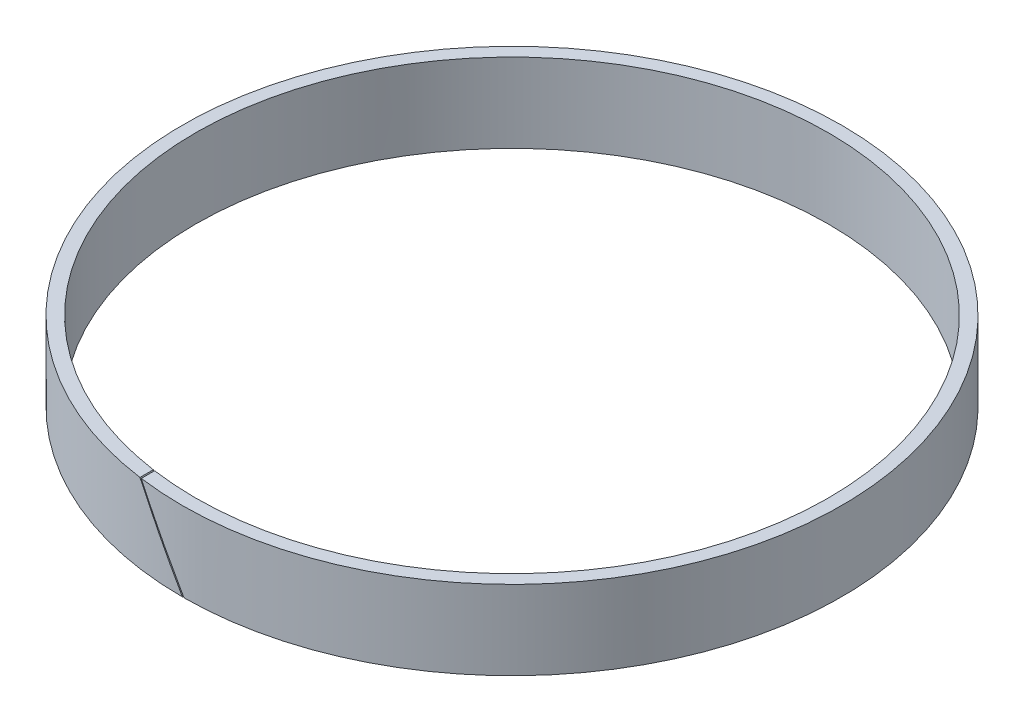
ISO-10303-21;
HEADER;
FILE_DESCRIPTION(('STEP AP214'),'2;1');
FILE_NAME('part.step','',(''),(''),'','','');
FILE_SCHEMA(('AUTOMOTIVE_DESIGN { 1 0 10303 214 1 1 1 1 }'));
ENDSEC;
DATA;
#1=APPLICATION_CONTEXT('core data for automotive mechanical design processes');
#2=APPLICATION_PROTOCOL_DEFINITION('international standard','automotive_design',2000,#1);
#3=PRODUCT_CONTEXT('',#1,'mechanical');
#4=PRODUCT('Part','Part','',(#3));
#5=PRODUCT_RELATED_PRODUCT_CATEGORY('part','',(#4));
#6=PRODUCT_DEFINITION_FORMATION('','',#4);
#7=PRODUCT_DEFINITION_CONTEXT('part definition',#1,'design');
#8=PRODUCT_DEFINITION('design','',#6,#7);
#9=PRODUCT_DEFINITION_SHAPE('','',#8);
#10=(LENGTH_UNIT() NAMED_UNIT(*) SI_UNIT(.MILLI.,.METRE.));
#11=(NAMED_UNIT(*) PLANE_ANGLE_UNIT() SI_UNIT($,.RADIAN.));
#12=(NAMED_UNIT(*) SI_UNIT($,.STERADIAN.) SOLID_ANGLE_UNIT());
#13=UNCERTAINTY_MEASURE_WITH_UNIT(LENGTH_MEASURE(1.E-05),#10,'distance_accuracy_value','');
#14=(GEOMETRIC_REPRESENTATION_CONTEXT(3) GLOBAL_UNCERTAINTY_ASSIGNED_CONTEXT((#13)) GLOBAL_UNIT_ASSIGNED_CONTEXT((#10,
#11,#12)) REPRESENTATION_CONTEXT('',''));
#15=CARTESIAN_POINT('',(0.,0.,0.));
#16=DIRECTION('',(0.,0.,1.));
#17=DIRECTION('',(1.,0.,0.));
#18=AXIS2_PLACEMENT_3D('',#15,#16,#17);
#19=CARTESIAN_POINT('',(0.,6.,0.));
#20=DIRECTION('',(0.,1.,0.));
#21=DIRECTION('',(0.,0.,1.));
#22=AXIS2_PLACEMENT_3D('',#19,#20,#21);
#23=PLANE('',#22);
#24=CARTESIAN_POINT('',(0.,6.,0.));
#25=DIRECTION('',(0.,1.,0.));
#26=DIRECTION('',(0.,0.,1.));
#27=AXIS2_PLACEMENT_3D('',#24,#25,#26);
#28=CIRCLE('',#27,24.);
#29=CARTESIAN_POINT('',(-3.34863156129984,6.,23.7652407239369));
#30=VERTEX_POINT('',#29);
#31=CARTESIAN_POINT('',(-3.46410161513777,6.,23.7486841740758));
#32=VERTEX_POINT('',#31);
#33=EDGE_CURVE('E93',#30,#32,#28,.T.);
#34=ORIENTED_EDGE('',*,*,#33,.F.);
#35=DIRECTION('',(0.,0.,-1.));
#36=VECTOR('',#35,1.);
#37=CARTESIAN_POINT('',(-3.34863156129984,6.00000000000001,25.001));
#38=LINE('',#37,#36);
#39=CARTESIAN_POINT('',(-3.34863156129984,6.,24.7747182964139));
#40=VERTEX_POINT('',#39);
#41=EDGE_CURVE('E65',#40,#30,#38,.T.);
#42=ORIENTED_EDGE('',*,*,#41,.F.);
#43=CARTESIAN_POINT('',(0.,6.,0.));
#44=DIRECTION('',(0.,1.,0.));
#45=DIRECTION('',(0.,0.,1.));
#46=AXIS2_PLACEMENT_3D('',#43,#44,#45);
#47=CIRCLE('',#46,25.);
#48=CARTESIAN_POINT('',(-3.46410161513777,6.00000000000001,24.7588368062799));
#49=VERTEX_POINT('',#48);
#50=EDGE_CURVE('E11',#40,#49,#47,.T.);
#51=ORIENTED_EDGE('',*,*,#50,.T.);
#52=DIRECTION('',(0.,0.,-1.));
#53=VECTOR('',#52,1.);
#54=CARTESIAN_POINT('',(-3.46410161513777,6.00000000000001,25.001));
#55=LINE('',#54,#53);
#56=EDGE_CURVE('E79',#49,#32,#55,.T.);
#57=ORIENTED_EDGE('',*,*,#56,.T.);
#58=EDGE_LOOP('',(#34,#42,#51,#57));
#59=FACE_BOUND('',#58,.T.);
#60=ADVANCED_FACE('F39',(#59),#23,.T.);
#61=CARTESIAN_POINT('',(0.,0.,0.));
#62=DIRECTION('',(0.,1.,0.));
#63=DIRECTION('',(0.,0.,1.));
#64=AXIS2_PLACEMENT_3D('',#61,#62,#63);
#65=PLANE('',#64);
#66=DIRECTION('',(0.,0.,-1.));
#67=VECTOR('',#66,1.);
#68=CARTESIAN_POINT('',(0.11547005383793,0.,25.001));
#69=LINE('',#68,#67);
#70=CARTESIAN_POINT('',(0.115470053837931,0.,24.9997333319111));
#71=VERTEX_POINT('',#70);
#72=CARTESIAN_POINT('',(0.11547005383793,0.,23.9997222206147));
#73=VERTEX_POINT('',#72);
#74=EDGE_CURVE('E87',#71,#73,#69,.T.);
#75=ORIENTED_EDGE('',*,*,#74,.T.);
#76=CARTESIAN_POINT('',(0.,0.,0.));
#77=DIRECTION('',(0.,1.,0.));
#78=DIRECTION('',(0.,0.,1.));
#79=AXIS2_PLACEMENT_3D('',#76,#77,#78);
#80=CIRCLE('',#79,24.);
#81=CARTESIAN_POINT('',(0.,0.,24.));
#82=VERTEX_POINT('',#81);
#83=EDGE_CURVE('E96',#73,#82,#80,.T.);
#84=ORIENTED_EDGE('',*,*,#83,.T.);
#85=DIRECTION('',(0.,0.,-1.));
#86=VECTOR('',#85,1.);
#87=CARTESIAN_POINT('',(0.,0.,25.001));
#88=LINE('',#87,#86);
#89=CARTESIAN_POINT('',(0.,0.,25.));
#90=VERTEX_POINT('',#89);
#91=EDGE_CURVE('E53',#90,#82,#88,.T.);
#92=ORIENTED_EDGE('',*,*,#91,.F.);
#93=CARTESIAN_POINT('',(0.,0.,0.));
#94=DIRECTION('',(0.,1.,0.));
#95=DIRECTION('',(0.,0.,1.));
#96=AXIS2_PLACEMENT_3D('',#93,#94,#95);
#97=CIRCLE('',#96,25.);
#98=EDGE_CURVE('E43',#71,#90,#97,.T.);
#99=ORIENTED_EDGE('',*,*,#98,.F.);
#100=EDGE_LOOP('',(#75,#84,#92,#99));
#101=FACE_BOUND('',#100,.T.);
#102=ADVANCED_FACE('F115',(#101),#65,.F.);
#103=CARTESIAN_POINT('',(0.,6.,0.));
#104=DIRECTION('',(0.,-1.,0.));
#105=DIRECTION('',(0.,0.,-1.));
#106=AXIS2_PLACEMENT_3D('',#103,#104,#105);
#107=CYLINDRICAL_SURFACE('',#106,25.);
#108=CARTESIAN_POINT('',(0.,0.200000000000006,0.));
#109=DIRECTION('',(-0.866025403784437,-0.500000000000002,0.));
#110=DIRECTION('',(0.500000000000002,-0.866025403784438,0.));
#111=AXIS2_PLACEMENT_3D('',#108,#109,#110);
#112=ELLIPSE('',#111,49.9999999999998,25.);
#113=EDGE_CURVE('E106',#40,#71,#112,.F.);
#114=ORIENTED_EDGE('',*,*,#113,.T.);
#115=ORIENTED_EDGE('',*,*,#98,.T.);
#116=CARTESIAN_POINT('',(0.,0.,0.));
#117=DIRECTION('',(0.866025403784438,0.500000000000001,0.));
#118=DIRECTION('',(0.500000000000001,-0.866025403784438,0.));
#119=AXIS2_PLACEMENT_3D('',#116,#117,#118);
#120=ELLIPSE('',#119,49.9999999999999,25.);
#121=EDGE_CURVE('E88',#90,#49,#120,.F.);
#122=ORIENTED_EDGE('',*,*,#121,.T.);
#123=ORIENTED_EDGE('',*,*,#50,.F.);
#124=EDGE_LOOP('',(#114,#115,#122,#123));
#125=FACE_BOUND('',#124,.T.);
#126=ADVANCED_FACE('F41',(#125),#107,.T.);
#127=CARTESIAN_POINT('',(0.,6.,0.));
#128=DIRECTION('',(0.,-1.,0.));
#129=DIRECTION('',(0.,0.,-1.));
#130=AXIS2_PLACEMENT_3D('',#127,#128,#129);
#131=CYLINDRICAL_SURFACE('',#130,24.);
#132=ORIENTED_EDGE('',*,*,#83,.F.);
#133=CARTESIAN_POINT('',(0.,0.200000000000006,0.));
#134=DIRECTION('',(-0.866025403784437,-0.500000000000002,0.));
#135=DIRECTION('',(0.500000000000002,-0.866025403784438,0.));
#136=AXIS2_PLACEMENT_3D('',#133,#134,#135);
#137=ELLIPSE('',#136,47.9999999999998,24.);
#138=EDGE_CURVE('E92',#30,#73,#137,.F.);
#139=ORIENTED_EDGE('',*,*,#138,.F.);
#140=ORIENTED_EDGE('',*,*,#33,.T.);
#141=CARTESIAN_POINT('',(0.,0.,0.));
#142=DIRECTION('',(0.866025403784438,0.500000000000001,0.));
#143=DIRECTION('',(0.500000000000001,-0.866025403784438,0.));
#144=AXIS2_PLACEMENT_3D('',#141,#142,#143);
#145=ELLIPSE('',#144,47.9999999999999,24.);
#146=EDGE_CURVE('E80',#82,#32,#145,.F.);
#147=ORIENTED_EDGE('',*,*,#146,.F.);
#148=EDGE_LOOP('',(#132,#139,#140,#147));
#149=FACE_BOUND('',#148,.T.);
#150=ADVANCED_FACE('F94',(#149),#131,.F.);
#151=CARTESIAN_POINT('',(0.,0.,25.001));
#152=DIRECTION('',(0.866025403784438,0.500000000000001,0.));
#153=DIRECTION('',(-0.500000000000001,0.866025403784438,0.));
#154=AXIS2_PLACEMENT_3D('',#151,#152,#153);
#155=PLANE('',#154);
#156=ORIENTED_EDGE('',*,*,#91,.T.);
#157=ORIENTED_EDGE('',*,*,#146,.T.);
#158=ORIENTED_EDGE('',*,*,#56,.F.);
#159=ORIENTED_EDGE('',*,*,#121,.F.);
#160=EDGE_LOOP('',(#156,#157,#158,#159));
#161=FACE_BOUND('',#160,.T.);
#162=ADVANCED_FACE('F78',(#161),#155,.T.);
#163=CARTESIAN_POINT('',(-3.34863156129984,6.00000000000001,25.001));
#164=DIRECTION('',(-0.866025403784437,-0.500000000000002,0.));
#165=DIRECTION('',(0.500000000000002,-0.866025403784438,0.));
#166=AXIS2_PLACEMENT_3D('',#163,#164,#165);
#167=PLANE('',#166);
#168=ORIENTED_EDGE('',*,*,#41,.T.);
#169=ORIENTED_EDGE('',*,*,#138,.T.);
#170=ORIENTED_EDGE('',*,*,#74,.F.);
#171=ORIENTED_EDGE('',*,*,#113,.F.);
#172=EDGE_LOOP('',(#168,#169,#170,#171));
#173=FACE_BOUND('',#172,.T.);
#174=ADVANCED_FACE('F108',(#173),#167,.T.);
#175=CLOSED_SHELL('',(#60,#102,#126,#150,#162,#174));
#176=MANIFOLD_SOLID_BREP('B2',#175);
#177=ADVANCED_BREP_SHAPE_REPRESENTATION('',(#18,#176),#14);
#178=SHAPE_DEFINITION_REPRESENTATION(#9,#177);
ENDSEC;
END-ISO-10303-21;
